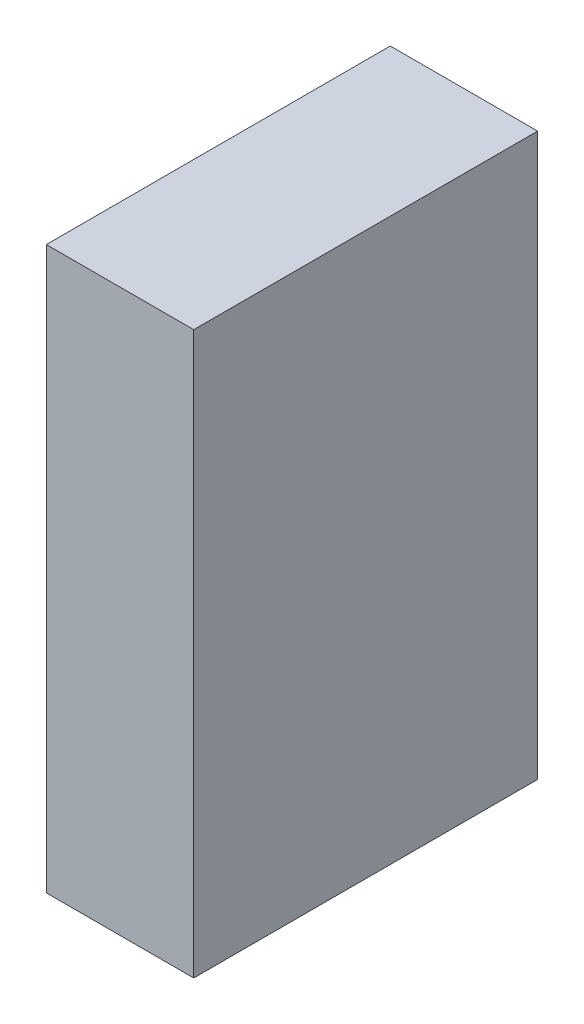
ISO-10303-21;
HEADER;
FILE_DESCRIPTION(('STEP AP214'),'2;1');
FILE_NAME('part.step','',(''),(''),'','','');
FILE_SCHEMA(('AUTOMOTIVE_DESIGN { 1 0 10303 214 1 1 1 1 }'));
ENDSEC;
DATA;
#1=APPLICATION_CONTEXT('core data for automotive mechanical design processes');
#2=APPLICATION_PROTOCOL_DEFINITION('international standard','automotive_design',2000,#1);
#3=PRODUCT_CONTEXT('',#1,'mechanical');
#4=PRODUCT('Part','Part','',(#3));
#5=PRODUCT_RELATED_PRODUCT_CATEGORY('part','',(#4));
#6=PRODUCT_DEFINITION_FORMATION('','',#4);
#7=PRODUCT_DEFINITION_CONTEXT('part definition',#1,'design');
#8=PRODUCT_DEFINITION('design','',#6,#7);
#9=PRODUCT_DEFINITION_SHAPE('','',#8);
#10=(LENGTH_UNIT() NAMED_UNIT(*) SI_UNIT(.MILLI.,.METRE.));
#11=(NAMED_UNIT(*) PLANE_ANGLE_UNIT() SI_UNIT($,.RADIAN.));
#12=(NAMED_UNIT(*) SI_UNIT($,.STERADIAN.) SOLID_ANGLE_UNIT());
#13=UNCERTAINTY_MEASURE_WITH_UNIT(LENGTH_MEASURE(1.E-05),#10,'distance_accuracy_value','');
#14=(GEOMETRIC_REPRESENTATION_CONTEXT(3) GLOBAL_UNCERTAINTY_ASSIGNED_CONTEXT((#13)) GLOBAL_UNIT_ASSIGNED_CONTEXT((#10,
#11,#12)) REPRESENTATION_CONTEXT('',''));
#15=CARTESIAN_POINT('',(0.,0.,0.));
#16=DIRECTION('',(0.,0.,1.));
#17=DIRECTION('',(1.,0.,0.));
#18=AXIS2_PLACEMENT_3D('',#15,#16,#17);
#19=CARTESIAN_POINT('',(42.,0.,0.));
#20=DIRECTION('',(0.,0.,-1.));
#21=DIRECTION('',(-1.,0.,0.));
#22=AXIS2_PLACEMENT_3D('',#19,#20,#21);
#23=PLANE('',#22);
#24=DIRECTION('',(0.,-1.,0.));
#25=VECTOR('',#24,1.);
#26=CARTESIAN_POINT('',(0.,0.,0.));
#27=LINE('',#26,#25);
#28=CARTESIAN_POINT('',(0.,160.,0.));
#29=VERTEX_POINT('',#28);
#30=CARTESIAN_POINT('',(0.,0.,0.));
#31=VERTEX_POINT('',#30);
#32=EDGE_CURVE('E107',#29,#31,#27,.T.);
#33=ORIENTED_EDGE('',*,*,#32,.T.);
#34=DIRECTION('',(-1.,0.,0.));
#35=VECTOR('',#34,1.);
#36=CARTESIAN_POINT('',(42.,0.,0.));
#37=LINE('',#36,#35);
#38=CARTESIAN_POINT('',(42.,0.,0.));
#39=VERTEX_POINT('',#38);
#40=EDGE_CURVE('E11',#39,#31,#37,.T.);
#41=ORIENTED_EDGE('',*,*,#40,.F.);
#42=DIRECTION('',(0.,-1.,0.));
#43=VECTOR('',#42,1.);
#44=CARTESIAN_POINT('',(42.,0.,0.));
#45=LINE('',#44,#43);
#46=CARTESIAN_POINT('',(42.,160.,0.));
#47=VERTEX_POINT('',#46);
#48=EDGE_CURVE('E91',#47,#39,#45,.T.);
#49=ORIENTED_EDGE('',*,*,#48,.F.);
#50=DIRECTION('',(-1.,0.,0.));
#51=VECTOR('',#50,1.);
#52=CARTESIAN_POINT('',(42.,160.,0.));
#53=LINE('',#52,#51);
#54=EDGE_CURVE('E103',#47,#29,#53,.T.);
#55=ORIENTED_EDGE('',*,*,#54,.T.);
#56=EDGE_LOOP('',(#33,#41,#49,#55));
#57=FACE_BOUND('',#56,.T.);
#58=ADVANCED_FACE('F39',(#57),#23,.F.);
#59=CARTESIAN_POINT('',(42.,0.,0.));
#60=DIRECTION('',(0.,1.,0.));
#61=DIRECTION('',(0.,0.,1.));
#62=AXIS2_PLACEMENT_3D('',#59,#60,#61);
#63=PLANE('',#62);
#64=DIRECTION('',(0.,0.,-1.));
#65=VECTOR('',#64,1.);
#66=CARTESIAN_POINT('',(0.,0.,0.));
#67=LINE('',#66,#65);
#68=CARTESIAN_POINT('',(0.,0.,-98.));
#69=VERTEX_POINT('',#68);
#70=EDGE_CURVE('E96',#31,#69,#67,.T.);
#71=ORIENTED_EDGE('',*,*,#70,.T.);
#72=DIRECTION('',(-1.,0.,0.));
#73=VECTOR('',#72,1.);
#74=CARTESIAN_POINT('',(42.,0.,-98.));
#75=LINE('',#74,#73);
#76=CARTESIAN_POINT('',(42.,0.,-98.));
#77=VERTEX_POINT('',#76);
#78=EDGE_CURVE('E48',#77,#69,#75,.T.);
#79=ORIENTED_EDGE('',*,*,#78,.F.);
#80=DIRECTION('',(0.,0.,-1.));
#81=VECTOR('',#80,1.);
#82=CARTESIAN_POINT('',(42.,0.,0.));
#83=LINE('',#82,#81);
#84=EDGE_CURVE('E86',#39,#77,#83,.T.);
#85=ORIENTED_EDGE('',*,*,#84,.F.);
#86=ORIENTED_EDGE('',*,*,#40,.T.);
#87=EDGE_LOOP('',(#71,#79,#85,#86));
#88=FACE_BOUND('',#87,.T.);
#89=ADVANCED_FACE('F95',(#88),#63,.F.);
#90=CARTESIAN_POINT('',(42.,0.,-98.));
#91=DIRECTION('',(0.,0.,1.));
#92=DIRECTION('',(1.,0.,0.));
#93=AXIS2_PLACEMENT_3D('',#90,#91,#92);
#94=PLANE('',#93);
#95=DIRECTION('',(0.,1.,0.));
#96=VECTOR('',#95,1.);
#97=CARTESIAN_POINT('',(0.,0.,-98.));
#98=LINE('',#97,#96);
#99=CARTESIAN_POINT('',(0.,160.,-98.));
#100=VERTEX_POINT('',#99);
#101=EDGE_CURVE('E73',#69,#100,#98,.T.);
#102=ORIENTED_EDGE('',*,*,#101,.T.);
#103=DIRECTION('',(-1.,0.,0.));
#104=VECTOR('',#103,1.);
#105=CARTESIAN_POINT('',(42.,160.,-98.));
#106=LINE('',#105,#104);
#107=CARTESIAN_POINT('',(42.,160.,-98.));
#108=VERTEX_POINT('',#107);
#109=EDGE_CURVE('E98',#108,#100,#106,.T.);
#110=ORIENTED_EDGE('',*,*,#109,.F.);
#111=DIRECTION('',(0.,1.,0.));
#112=VECTOR('',#111,1.);
#113=CARTESIAN_POINT('',(42.,0.,-98.));
#114=LINE('',#113,#112);
#115=EDGE_CURVE('E89',#77,#108,#114,.T.);
#116=ORIENTED_EDGE('',*,*,#115,.F.);
#117=ORIENTED_EDGE('',*,*,#78,.T.);
#118=EDGE_LOOP('',(#102,#110,#116,#117));
#119=FACE_BOUND('',#118,.T.);
#120=ADVANCED_FACE('F99',(#119),#94,.F.);
#121=CARTESIAN_POINT('',(42.,160.,0.));
#122=DIRECTION('',(0.,-1.,0.));
#123=DIRECTION('',(0.,0.,-1.));
#124=AXIS2_PLACEMENT_3D('',#121,#122,#123);
#125=PLANE('',#124);
#126=DIRECTION('',(0.,0.,1.));
#127=VECTOR('',#126,1.);
#128=CARTESIAN_POINT('',(0.,160.,0.));
#129=LINE('',#128,#127);
#130=EDGE_CURVE('E79',#100,#29,#129,.T.);
#131=ORIENTED_EDGE('',*,*,#130,.T.);
#132=ORIENTED_EDGE('',*,*,#54,.F.);
#133=DIRECTION('',(0.,0.,1.));
#134=VECTOR('',#133,1.);
#135=CARTESIAN_POINT('',(42.,160.,0.));
#136=LINE('',#135,#134);
#137=EDGE_CURVE('E56',#108,#47,#136,.T.);
#138=ORIENTED_EDGE('',*,*,#137,.F.);
#139=ORIENTED_EDGE('',*,*,#109,.T.);
#140=EDGE_LOOP('',(#131,#132,#138,#139));
#141=FACE_BOUND('',#140,.T.);
#142=ADVANCED_FACE('F120',(#141),#125,.F.);
#143=CARTESIAN_POINT('',(42.,0.,0.));
#144=DIRECTION('',(-1.,0.,0.));
#145=DIRECTION('',(0.,0.,1.));
#146=AXIS2_PLACEMENT_3D('',#143,#144,#145);
#147=PLANE('',#146);
#148=ORIENTED_EDGE('',*,*,#48,.T.);
#149=ORIENTED_EDGE('',*,*,#84,.T.);
#150=ORIENTED_EDGE('',*,*,#115,.T.);
#151=ORIENTED_EDGE('',*,*,#137,.T.);
#152=EDGE_LOOP('',(#148,#149,#150,#151));
#153=FACE_BOUND('',#152,.T.);
#154=ADVANCED_FACE('F87',(#153),#147,.F.);
#155=CARTESIAN_POINT('',(0.,0.,0.));
#156=DIRECTION('',(-1.,0.,0.));
#157=DIRECTION('',(0.,0.,1.));
#158=AXIS2_PLACEMENT_3D('',#155,#156,#157);
#159=PLANE('',#158);
#160=ORIENTED_EDGE('',*,*,#32,.F.);
#161=ORIENTED_EDGE('',*,*,#130,.F.);
#162=ORIENTED_EDGE('',*,*,#101,.F.);
#163=ORIENTED_EDGE('',*,*,#70,.F.);
#164=EDGE_LOOP('',(#160,#161,#162,#163));
#165=FACE_BOUND('',#164,.T.);
#166=ADVANCED_FACE('F123',(#165),#159,.T.);
#167=CLOSED_SHELL('',(#58,#89,#120,#142,#154,#166));
#168=MANIFOLD_SOLID_BREP('B2',#167);
#169=ADVANCED_BREP_SHAPE_REPRESENTATION('',(#18,#168),#14);
#170=SHAPE_DEFINITION_REPRESENTATION(#9,#169);
ENDSEC;
END-ISO-10303-21;
